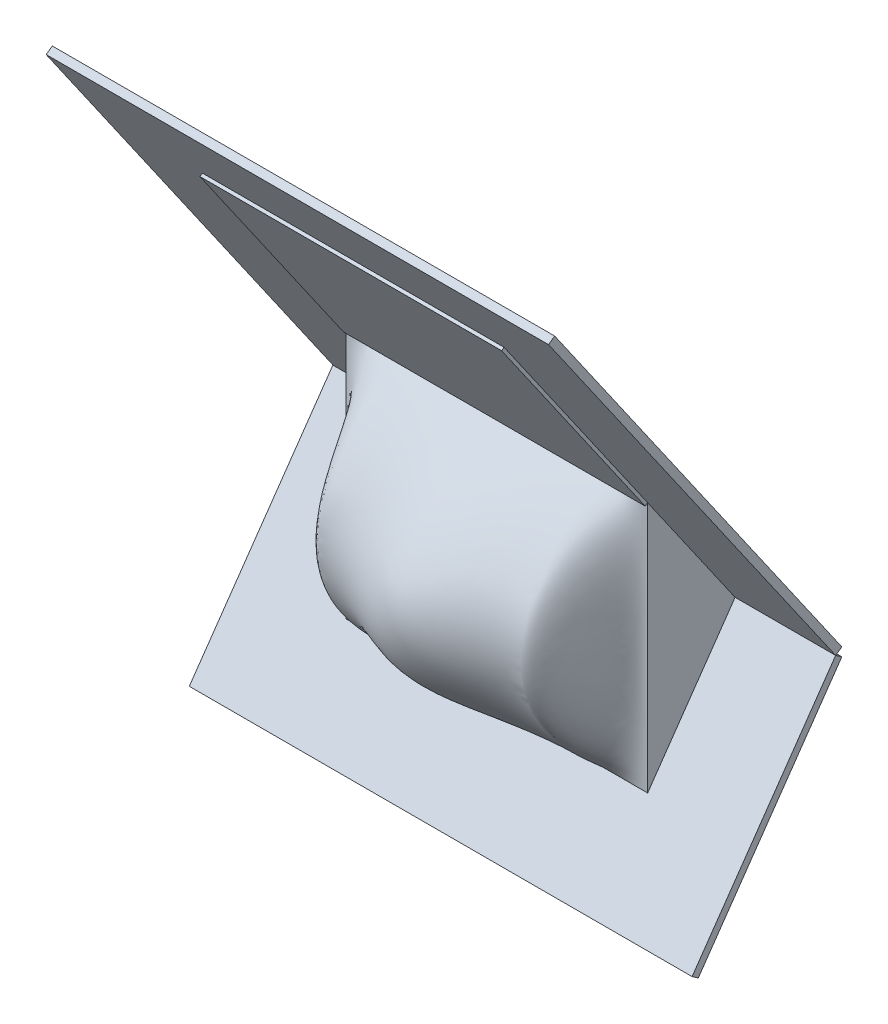
ISO-10303-21;
HEADER;
FILE_DESCRIPTION(('STEP AP214'),'2;1');
FILE_NAME('part.step','',(''),(''),'','','');
FILE_SCHEMA(('AUTOMOTIVE_DESIGN { 1 0 10303 214 1 1 1 1 }'));
ENDSEC;
DATA;
#1=APPLICATION_CONTEXT('core data for automotive mechanical design processes');
#2=APPLICATION_PROTOCOL_DEFINITION('international standard','automotive_design',2000,#1);
#3=PRODUCT_CONTEXT('',#1,'mechanical');
#4=PRODUCT('Part','Part','',(#3));
#5=PRODUCT_RELATED_PRODUCT_CATEGORY('part','',(#4));
#6=PRODUCT_DEFINITION_FORMATION('','',#4);
#7=PRODUCT_DEFINITION_CONTEXT('part definition',#1,'design');
#8=PRODUCT_DEFINITION('design','',#6,#7);
#9=PRODUCT_DEFINITION_SHAPE('','',#8);
#10=(LENGTH_UNIT() NAMED_UNIT(*) SI_UNIT(.MILLI.,.METRE.));
#11=(NAMED_UNIT(*) PLANE_ANGLE_UNIT() SI_UNIT($,.RADIAN.));
#12=(NAMED_UNIT(*) SI_UNIT($,.STERADIAN.) SOLID_ANGLE_UNIT());
#13=UNCERTAINTY_MEASURE_WITH_UNIT(LENGTH_MEASURE(1.E-05),#10,'distance_accuracy_value','');
#14=(GEOMETRIC_REPRESENTATION_CONTEXT(3) GLOBAL_UNCERTAINTY_ASSIGNED_CONTEXT((#13)) GLOBAL_UNIT_ASSIGNED_CONTEXT((#10,
#11,#12)) REPRESENTATION_CONTEXT('',''));
#15=CARTESIAN_POINT('',(0.,0.,0.));
#16=DIRECTION('',(0.,0.,1.));
#17=DIRECTION('',(1.,0.,0.));
#18=AXIS2_PLACEMENT_3D('',#15,#16,#17);
#19=CARTESIAN_POINT('',(0.,-0.140637872858713,0.202163097279363));
#20=DIRECTION('',(0.,-0.571071807278898,0.820900110202948));
#21=DIRECTION('',(0.,-0.820900110202948,-0.571071807278898));
#22=AXIS2_PLACEMENT_3D('',#19,#20,#21);
#23=PLANE('',#22);
#24=DIRECTION('',(0.,-0.820900110202948,-0.571071807278898));
#25=VECTOR('',#24,1.);
#26=CARTESIAN_POINT('',(10.,-5.,-3.17832702286831));
#27=LINE('',#26,#25);
#28=CARTESIAN_POINT('',(10.,11.418002204059,8.24310912270965));
#29=VERTEX_POINT('',#28);
#30=CARTESIAN_POINT('',(10.,-5.,-3.17832702286831));
#31=VERTEX_POINT('',#30);
#32=EDGE_CURVE('E256',#29,#31,#27,.T.);
#33=ORIENTED_EDGE('',*,*,#32,.F.);
#34=DIRECTION('',(1.,0.,0.));
#35=VECTOR('',#34,1.);
#36=CARTESIAN_POINT('',(10.,11.418002204059,8.24310912270965));
#37=LINE('',#36,#35);
#38=CARTESIAN_POINT('',(-9.98236155550138,11.418002204059,8.24310912270965));
#39=VERTEX_POINT('',#38);
#40=EDGE_CURVE('E261',#39,#29,#37,.T.);
#41=ORIENTED_EDGE('',*,*,#40,.F.);
#42=DIRECTION('',(0.,0.820900110202948,0.571071807278898));
#43=VECTOR('',#42,1.);
#44=CARTESIAN_POINT('',(-9.98236155550138,-5.,-3.17832702286831));
#45=LINE('',#44,#43);
#46=CARTESIAN_POINT('',(-9.98236155550138,-5.,-3.17832702286831));
#47=VERTEX_POINT('',#46);
#48=EDGE_CURVE('E272',#47,#39,#45,.T.);
#49=ORIENTED_EDGE('',*,*,#48,.F.);
#50=DIRECTION('',(-1.,0.,0.));
#51=VECTOR('',#50,1.);
#52=CARTESIAN_POINT('',(10.,-5.,-3.17832702286831));
#53=LINE('',#52,#51);
#54=EDGE_CURVE('E270',#31,#47,#53,.T.);
#55=ORIENTED_EDGE('',*,*,#54,.F.);
#56=EDGE_LOOP('',(#33,#41,#49,#55));
#57=FACE_BOUND('',#56,.T.);
#58=DIRECTION('',(1.,0.,0.));
#59=VECTOR('',#58,1.);
#60=CARTESIAN_POINT('',(-5.99999999999999,0.,0.299999999999999));
#61=LINE('',#60,#59);
#62=CARTESIAN_POINT('',(-5.99999999999999,0.,0.299999999999999));
#63=VERTEX_POINT('',#62);
#64=CARTESIAN_POINT('',(6.00000000000001,0.,0.299999999999999));
#65=VERTEX_POINT('',#64);
#66=EDGE_CURVE('E446',#63,#65,#61,.T.);
#67=ORIENTED_EDGE('',*,*,#66,.F.);
#68=DIRECTION('',(0.,-0.820900110202948,-0.571071807278898));
#69=VECTOR('',#68,1.);
#70=CARTESIAN_POINT('',(-5.99999999999999,0.,0.299999999999999));
#71=LINE('',#70,#69);
#72=CARTESIAN_POINT('',(-5.99999999999999,8.20900110202948,6.01071807278898));
#73=VERTEX_POINT('',#72);
#74=EDGE_CURVE('E220',#73,#63,#71,.T.);
#75=ORIENTED_EDGE('',*,*,#74,.F.);
#76=DIRECTION('',(-1.,0.,0.));
#77=VECTOR('',#76,1.);
#78=CARTESIAN_POINT('',(-5.99999999999999,8.20900110202948,6.01071807278898));
#79=LINE('',#78,#77);
#80=CARTESIAN_POINT('',(6.00000000000001,8.20900110202948,6.01071807278898));
#81=VERTEX_POINT('',#80);
#82=EDGE_CURVE('E216',#81,#73,#79,.T.);
#83=ORIENTED_EDGE('',*,*,#82,.F.);
#84=DIRECTION('',(0.,0.820900110202948,0.571071807278898));
#85=VECTOR('',#84,1.);
#86=CARTESIAN_POINT('',(6.00000000000001,0.,0.299999999999999));
#87=LINE('',#86,#85);
#88=EDGE_CURVE('E443',#65,#81,#87,.T.);
#89=ORIENTED_EDGE('',*,*,#88,.F.);
#90=EDGE_LOOP('',(#67,#75,#83,#89));
#91=FACE_BOUND('',#90,.T.);
#92=ADVANCED_FACE('F108',(#57,#91),#23,.T.);
#93=CARTESIAN_POINT('',(0.,0.0306836693249566,-0.0441069357815213));
#94=DIRECTION('',(0.,-0.571071807278898,0.820900110202948));
#95=DIRECTION('',(0.,-0.820900110202948,-0.571071807278898));
#96=AXIS2_PLACEMENT_3D('',#93,#94,#95);
#97=PLANE('',#96);
#98=DIRECTION('',(0.,-0.820900110202948,-0.571071807278898));
#99=VECTOR('',#98,1.);
#100=CARTESIAN_POINT('',(10.,-4.82867845781633,-3.4245970559292));
#101=LINE('',#100,#99);
#102=CARTESIAN_POINT('',(10.,11.5893237462426,7.99683908964877));
#103=VERTEX_POINT('',#102);
#104=CARTESIAN_POINT('',(10.,-4.82867845781633,-3.4245970559292));
#105=VERTEX_POINT('',#104);
#106=EDGE_CURVE('E257',#103,#105,#101,.T.);
#107=ORIENTED_EDGE('',*,*,#106,.T.);
#108=DIRECTION('',(-1.,0.,0.));
#109=VECTOR('',#108,1.);
#110=CARTESIAN_POINT('',(10.,-4.82867845781633,-3.4245970559292));
#111=LINE('',#110,#109);
#112=CARTESIAN_POINT('',(-9.98236155550138,-4.82867845781633,-3.4245970559292));
#113=VERTEX_POINT('',#112);
#114=EDGE_CURVE('E260',#105,#113,#111,.T.);
#115=ORIENTED_EDGE('',*,*,#114,.T.);
#116=DIRECTION('',(0.,0.820900110202948,0.571071807278898));
#117=VECTOR('',#116,1.);
#118=CARTESIAN_POINT('',(-9.98236155550138,-4.82867845781633,-3.4245970559292));
#119=LINE('',#118,#117);
#120=CARTESIAN_POINT('',(-9.98236155550138,11.5893237462426,7.99683908964877));
#121=VERTEX_POINT('',#120);
#122=EDGE_CURVE('E263',#113,#121,#119,.T.);
#123=ORIENTED_EDGE('',*,*,#122,.T.);
#124=DIRECTION('',(1.,0.,0.));
#125=VECTOR('',#124,1.);
#126=CARTESIAN_POINT('',(10.,11.5893237462426,7.99683908964877));
#127=LINE('',#126,#125);
#128=EDGE_CURVE('E265',#121,#103,#127,.T.);
#129=ORIENTED_EDGE('',*,*,#128,.T.);
#130=EDGE_LOOP('',(#107,#115,#123,#129));
#131=FACE_BOUND('',#130,.T.);
#132=DIRECTION('',(1.,0.,0.));
#133=VECTOR('',#132,1.);
#134=CARTESIAN_POINT('',(-5.99999999999999,8.38032264421315,5.7644480397281));
#135=LINE('',#134,#133);
#136=CARTESIAN_POINT('',(-5.99999999999999,8.38032264421315,5.7644480397281));
#137=VERTEX_POINT('',#136);
#138=CARTESIAN_POINT('',(6.00000000000001,8.38032264421315,5.7644480397281));
#139=VERTEX_POINT('',#138);
#140=EDGE_CURVE('E222',#137,#139,#135,.T.);
#141=ORIENTED_EDGE('',*,*,#140,.F.);
#142=DIRECTION('',(0.,0.820900110202948,0.571071807278898));
#143=VECTOR('',#142,1.);
#144=CARTESIAN_POINT('',(-5.99999999999999,0.17132154218367,0.0537299669391148));
#145=LINE('',#144,#143);
#146=CARTESIAN_POINT('',(-5.99999999999999,0.17132154218367,0.0537299669391148));
#147=VERTEX_POINT('',#146);
#148=EDGE_CURVE('E233',#147,#137,#145,.T.);
#149=ORIENTED_EDGE('',*,*,#148,.F.);
#150=DIRECTION('',(-1.,0.,0.));
#151=VECTOR('',#150,1.);
#152=CARTESIAN_POINT('',(6.00000000000001,0.17132154218367,0.0537299669391148));
#153=LINE('',#152,#151);
#154=CARTESIAN_POINT('',(6.00000000000001,0.17132154218367,0.0537299669391148));
#155=VERTEX_POINT('',#154);
#156=EDGE_CURVE('E241',#155,#147,#153,.T.);
#157=ORIENTED_EDGE('',*,*,#156,.F.);
#158=DIRECTION('',(0.,-0.820900110202948,-0.571071807278898));
#159=VECTOR('',#158,1.);
#160=CARTESIAN_POINT('',(6.00000000000001,8.38032264421315,5.7644480397281));
#161=LINE('',#160,#159);
#162=EDGE_CURVE('E131',#139,#155,#161,.T.);
#163=ORIENTED_EDGE('',*,*,#162,.F.);
#164=EDGE_LOOP('',(#141,#149,#157,#163));
#165=FACE_BOUND('',#164,.T.);
#166=ADVANCED_FACE('F299',(#131,#165),#97,.F.);
#167=CARTESIAN_POINT('',(10.,-4.82867845781633,-3.4245970559292));
#168=DIRECTION('',(-1.,0.,0.));
#169=DIRECTION('',(0.,0.,1.));
#170=AXIS2_PLACEMENT_3D('',#167,#168,#169);
#171=PLANE('',#170);
#172=ORIENTED_EDGE('',*,*,#32,.T.);
#173=DIRECTION('',(0.,-0.571071807278898,0.820900110202948));
#174=VECTOR('',#173,1.);
#175=CARTESIAN_POINT('',(10.,-4.82867845781633,-3.4245970559292));
#176=LINE('',#175,#174);
#177=EDGE_CURVE('E14',#105,#31,#176,.T.);
#178=ORIENTED_EDGE('',*,*,#177,.F.);
#179=ORIENTED_EDGE('',*,*,#106,.F.);
#180=DIRECTION('',(0.,-0.571071807278898,0.820900110202948));
#181=VECTOR('',#180,1.);
#182=CARTESIAN_POINT('',(10.,11.5893237462426,7.99683908964877));
#183=LINE('',#182,#181);
#184=EDGE_CURVE('E267',#103,#29,#183,.T.);
#185=ORIENTED_EDGE('',*,*,#184,.T.);
#186=EDGE_LOOP('',(#172,#178,#179,#185));
#187=FACE_BOUND('',#186,.T.);
#188=ADVANCED_FACE('F110',(#187),#171,.F.);
#189=CARTESIAN_POINT('',(10.,-4.82867845781633,-3.4245970559292));
#190=DIRECTION('',(0.,0.820900110202948,0.571071807278898));
#191=DIRECTION('',(0.,-0.571071807278898,0.820900110202949));
#192=AXIS2_PLACEMENT_3D('',#189,#190,#191);
#193=PLANE('',#192);
#194=ORIENTED_EDGE('',*,*,#54,.T.);
#195=DIRECTION('',(0.,-0.571071807278898,0.820900110202948));
#196=VECTOR('',#195,1.);
#197=CARTESIAN_POINT('',(-9.98236155550138,-4.82867845781633,-3.4245970559292));
#198=LINE('',#197,#196);
#199=EDGE_CURVE('E116',#113,#47,#198,.T.);
#200=ORIENTED_EDGE('',*,*,#199,.F.);
#201=ORIENTED_EDGE('',*,*,#114,.F.);
#202=ORIENTED_EDGE('',*,*,#177,.T.);
#203=EDGE_LOOP('',(#194,#200,#201,#202));
#204=FACE_BOUND('',#203,.T.);
#205=ADVANCED_FACE('F300',(#204),#193,.F.);
#206=CARTESIAN_POINT('',(-9.98236155550138,-4.82867845781633,-3.4245970559292));
#207=DIRECTION('',(1.,0.,0.));
#208=DIRECTION('',(0.,0.,-1.));
#209=AXIS2_PLACEMENT_3D('',#206,#207,#208);
#210=PLANE('',#209);
#211=ORIENTED_EDGE('',*,*,#48,.T.);
#212=DIRECTION('',(0.,-0.571071807278898,0.820900110202948));
#213=VECTOR('',#212,1.);
#214=CARTESIAN_POINT('',(-9.98236155550138,11.5893237462426,7.99683908964877));
#215=LINE('',#214,#213);
#216=EDGE_CURVE('E277',#121,#39,#215,.T.);
#217=ORIENTED_EDGE('',*,*,#216,.F.);
#218=ORIENTED_EDGE('',*,*,#122,.F.);
#219=ORIENTED_EDGE('',*,*,#199,.T.);
#220=EDGE_LOOP('',(#211,#217,#218,#219));
#221=FACE_BOUND('',#220,.T.);
#222=ADVANCED_FACE('F284',(#221),#210,.F.);
#223=CARTESIAN_POINT('',(10.,11.5893237462426,7.99683908964877));
#224=DIRECTION('',(0.,-0.820900110202948,-0.571071807278898));
#225=DIRECTION('',(0.,0.571071807278898,-0.820900110202949));
#226=AXIS2_PLACEMENT_3D('',#223,#224,#225);
#227=PLANE('',#226);
#228=ORIENTED_EDGE('',*,*,#40,.T.);
#229=ORIENTED_EDGE('',*,*,#184,.F.);
#230=ORIENTED_EDGE('',*,*,#128,.F.);
#231=ORIENTED_EDGE('',*,*,#216,.T.);
#232=EDGE_LOOP('',(#228,#229,#230,#231));
#233=FACE_BOUND('',#232,.T.);
#234=ADVANCED_FACE('F293',(#233),#227,.F.);
#235=CARTESIAN_POINT('',(-5.99999999999999,8.43742982494104,5.6823580287078));
#236=DIRECTION('',(0.,-0.820900110202949,-0.571071807278898));
#237=DIRECTION('',(0.,0.571071807278898,-0.820900110202949));
#238=AXIS2_PLACEMENT_3D('',#235,#236,#237);
#239=PLANE('',#238);
#240=ORIENTED_EDGE('',*,*,#140,.T.);
#241=DIRECTION('',(0.,-0.571071807278898,0.820900110202949));
#242=VECTOR('',#241,1.);
#243=CARTESIAN_POINT('',(6.00000000000001,8.43742982494104,5.6823580287078));
#244=LINE('',#243,#242);
#245=CARTESIAN_POINT('',(6.00000000000001,8.43742982494104,5.6823580287078));
#246=VERTEX_POINT('',#245);
#247=EDGE_CURVE('E254',#246,#139,#244,.T.);
#248=ORIENTED_EDGE('',*,*,#247,.F.);
#249=DIRECTION('',(1.,0.,0.));
#250=VECTOR('',#249,1.);
#251=CARTESIAN_POINT('',(-5.99999999999999,8.43742982494104,5.6823580287078));
#252=LINE('',#251,#250);
#253=CARTESIAN_POINT('',(-5.99999999999999,8.43742982494104,5.6823580287078));
#254=VERTEX_POINT('',#253);
#255=EDGE_CURVE('E229',#254,#246,#252,.T.);
#256=ORIENTED_EDGE('',*,*,#255,.F.);
#257=DIRECTION('',(0.,-0.571071807278898,0.820900110202949));
#258=VECTOR('',#257,1.);
#259=CARTESIAN_POINT('',(-5.99999999999999,8.43742982494104,5.6823580287078));
#260=LINE('',#259,#258);
#261=EDGE_CURVE('E238',#254,#137,#260,.T.);
#262=ORIENTED_EDGE('',*,*,#261,.T.);
#263=EDGE_LOOP('',(#240,#248,#256,#262));
#264=FACE_BOUND('',#263,.T.);
#265=ADVANCED_FACE('F316',(#264),#239,.F.);
#266=CARTESIAN_POINT('',(6.00000000000001,8.43742982494104,5.6823580287078));
#267=DIRECTION('',(-1.,0.,0.));
#268=DIRECTION('',(0.,0.,1.));
#269=AXIS2_PLACEMENT_3D('',#266,#267,#268);
#270=PLANE('',#269);
#271=ORIENTED_EDGE('',*,*,#162,.T.);
#272=DIRECTION('',(0.,-0.571071807278898,0.820900110202949));
#273=VECTOR('',#272,1.);
#274=CARTESIAN_POINT('',(6.00000000000001,0.22842872291156,-0.02836004408118));
#275=LINE('',#274,#273);
#276=CARTESIAN_POINT('',(6.00000000000001,0.22842872291156,-0.02836004408118));
#277=VERTEX_POINT('',#276);
#278=EDGE_CURVE('E251',#277,#155,#275,.T.);
#279=ORIENTED_EDGE('',*,*,#278,.F.);
#280=DIRECTION('',(0.,-0.820900110202948,-0.571071807278898));
#281=VECTOR('',#280,1.);
#282=CARTESIAN_POINT('',(6.00000000000001,8.43742982494104,5.6823580287078));
#283=LINE('',#282,#281);
#284=EDGE_CURVE('E232',#246,#277,#283,.T.);
#285=ORIENTED_EDGE('',*,*,#284,.F.);
#286=ORIENTED_EDGE('',*,*,#247,.T.);
#287=EDGE_LOOP('',(#271,#279,#285,#286));
#288=FACE_BOUND('',#287,.T.);
#289=ADVANCED_FACE('F320',(#288),#270,.F.);
#290=CARTESIAN_POINT('',(6.00000000000001,0.22842872291156,-0.02836004408118));
#291=DIRECTION('',(0.,0.820900110202949,0.571071807278898));
#292=DIRECTION('',(0.,-0.571071807278898,0.820900110202949));
#293=AXIS2_PLACEMENT_3D('',#290,#291,#292);
#294=PLANE('',#293);
#295=ORIENTED_EDGE('',*,*,#156,.T.);
#296=DIRECTION('',(0.,-0.571071807278898,0.820900110202949));
#297=VECTOR('',#296,1.);
#298=CARTESIAN_POINT('',(-5.99999999999999,0.22842872291156,-0.02836004408118));
#299=LINE('',#298,#297);
#300=CARTESIAN_POINT('',(-5.99999999999999,0.22842872291156,-0.02836004408118));
#301=VERTEX_POINT('',#300);
#302=EDGE_CURVE('E248',#301,#147,#299,.T.);
#303=ORIENTED_EDGE('',*,*,#302,.F.);
#304=DIRECTION('',(-1.,0.,0.));
#305=VECTOR('',#304,1.);
#306=CARTESIAN_POINT('',(6.00000000000001,0.22842872291156,-0.02836004408118));
#307=LINE('',#306,#305);
#308=EDGE_CURVE('E235',#277,#301,#307,.T.);
#309=ORIENTED_EDGE('',*,*,#308,.F.);
#310=ORIENTED_EDGE('',*,*,#278,.T.);
#311=EDGE_LOOP('',(#295,#303,#309,#310));
#312=FACE_BOUND('',#311,.T.);
#313=ADVANCED_FACE('F325',(#312),#294,.F.);
#314=CARTESIAN_POINT('',(-5.99999999999999,0.22842872291156,-0.02836004408118));
#315=DIRECTION('',(1.,0.,0.));
#316=DIRECTION('',(0.,0.,-1.));
#317=AXIS2_PLACEMENT_3D('',#314,#315,#316);
#318=PLANE('',#317);
#319=ORIENTED_EDGE('',*,*,#148,.T.);
#320=ORIENTED_EDGE('',*,*,#261,.F.);
#321=DIRECTION('',(0.,0.820900110202948,0.571071807278898));
#322=VECTOR('',#321,1.);
#323=CARTESIAN_POINT('',(-5.99999999999999,0.22842872291156,-0.02836004408118));
#324=LINE('',#323,#322);
#325=EDGE_CURVE('E237',#301,#254,#324,.T.);
#326=ORIENTED_EDGE('',*,*,#325,.F.);
#327=ORIENTED_EDGE('',*,*,#302,.T.);
#328=EDGE_LOOP('',(#319,#320,#326,#327));
#329=FACE_BOUND('',#328,.T.);
#330=ADVANCED_FACE('F331',(#329),#318,.F.);
#331=CARTESIAN_POINT('',(0.,0.0877908500528464,-0.126196946801816));
#332=DIRECTION('',(0.,0.571071807278898,-0.820900110202948));
#333=DIRECTION('',(0.,0.820900110202948,0.571071807278898));
#334=AXIS2_PLACEMENT_3D('',#331,#332,#333);
#335=PLANE('',#334);
#336=ORIENTED_EDGE('',*,*,#255,.T.);
#337=ORIENTED_EDGE('',*,*,#284,.T.);
#338=ORIENTED_EDGE('',*,*,#308,.T.);
#339=ORIENTED_EDGE('',*,*,#325,.T.);
#340=EDGE_LOOP('',(#336,#337,#338,#339));
#341=FACE_BOUND('',#340,.T.);
#342=ADVANCED_FACE('F335',(#341),#335,.T.);
#343=CARTESIAN_POINT('',(-5.99999999999999,-0.0685286168734674,0.398508013224353));
#344=DIRECTION('',(1.,0.,0.));
#345=DIRECTION('',(0.,0.,-1.));
#346=AXIS2_PLACEMENT_3D('',#343,#344,#345);
#347=PLANE('',#346);
#348=ORIENTED_EDGE('',*,*,#74,.T.);
#349=DIRECTION('',(0.,0.571071807278898,-0.820900110202948));
#350=VECTOR('',#349,1.);
#351=CARTESIAN_POINT('',(-5.99999999999999,-0.0685286168734674,0.398508013224353));
#352=LINE('',#351,#350);
#353=CARTESIAN_POINT('',(-5.99999999999999,-0.0685286168734674,0.398508013224353));
#354=VERTEX_POINT('',#353);
#355=EDGE_CURVE('E201',#354,#63,#352,.T.);
#356=ORIENTED_EDGE('',*,*,#355,.F.);
#357=DIRECTION('',(0.,-0.820900110202948,-0.571071807278898));
#358=VECTOR('',#357,1.);
#359=CARTESIAN_POINT('',(-5.99999999999999,-0.0685286168734674,0.398508013224353));
#360=LINE('',#359,#358);
#361=CARTESIAN_POINT('',(-5.99999999999999,8.14047248515602,6.10922608601334));
#362=VERTEX_POINT('',#361);
#363=EDGE_CURVE('E208',#362,#354,#360,.T.);
#364=ORIENTED_EDGE('',*,*,#363,.F.);
#365=DIRECTION('',(0.,0.571071807278898,-0.820900110202948));
#366=VECTOR('',#365,1.);
#367=CARTESIAN_POINT('',(-5.99999999999999,8.14047248515602,6.10922608601334));
#368=LINE('',#367,#366);
#369=EDGE_CURVE('E441',#362,#73,#368,.T.);
#370=ORIENTED_EDGE('',*,*,#369,.T.);
#371=EDGE_LOOP('',(#348,#356,#364,#370));
#372=FACE_BOUND('',#371,.T.);
#373=ADVANCED_FACE('F218',(#372),#347,.F.);
#374=CARTESIAN_POINT('',(-5.99999999999999,-0.0685286168734674,0.398508013224353));
#375=DIRECTION('',(0.,0.820900110202948,0.571071807278898));
#376=DIRECTION('',(0.,-0.571071807278898,0.820900110202948));
#377=AXIS2_PLACEMENT_3D('',#374,#375,#376);
#378=PLANE('',#377);
#379=ORIENTED_EDGE('',*,*,#66,.T.);
#380=DIRECTION('',(0.,0.571071807278898,-0.820900110202948));
#381=VECTOR('',#380,1.);
#382=CARTESIAN_POINT('',(6.00000000000001,-0.0685286168734674,0.398508013224353));
#383=LINE('',#382,#381);
#384=CARTESIAN_POINT('',(6.00000000000001,-0.0685286168734674,0.398508013224353));
#385=VERTEX_POINT('',#384);
#386=EDGE_CURVE('E204',#385,#65,#383,.T.);
#387=ORIENTED_EDGE('',*,*,#386,.F.);
#388=DIRECTION('',(1.,0.,0.));
#389=VECTOR('',#388,1.);
#390=CARTESIAN_POINT('',(-5.99999999999999,-0.0685286168734674,0.398508013224353));
#391=LINE('',#390,#389);
#392=EDGE_CURVE('E197',#354,#385,#391,.T.);
#393=ORIENTED_EDGE('',*,*,#392,.F.);
#394=ORIENTED_EDGE('',*,*,#355,.T.);
#395=EDGE_LOOP('',(#379,#387,#393,#394));
#396=FACE_BOUND('',#395,.T.);
#397=ADVANCED_FACE('F199',(#396),#378,.F.);
#398=CARTESIAN_POINT('',(6.00000000000001,-0.0685286168734674,0.398508013224353));
#399=DIRECTION('',(-1.,0.,0.));
#400=DIRECTION('',(0.,0.,1.));
#401=AXIS2_PLACEMENT_3D('',#398,#399,#400);
#402=PLANE('',#401);
#403=ORIENTED_EDGE('',*,*,#88,.T.);
#404=DIRECTION('',(0.,0.571071807278898,-0.820900110202948));
#405=VECTOR('',#404,1.);
#406=CARTESIAN_POINT('',(6.00000000000001,8.14047248515602,6.10922608601334));
#407=LINE('',#406,#405);
#408=CARTESIAN_POINT('',(6.00000000000001,8.14047248515602,6.10922608601334));
#409=VERTEX_POINT('',#408);
#410=EDGE_CURVE('E123',#409,#81,#407,.T.);
#411=ORIENTED_EDGE('',*,*,#410,.F.);
#412=DIRECTION('',(0.,0.820900110202948,0.571071807278898));
#413=VECTOR('',#412,1.);
#414=CARTESIAN_POINT('',(6.00000000000001,-0.0685286168734674,0.398508013224353));
#415=LINE('',#414,#413);
#416=EDGE_CURVE('E207',#385,#409,#415,.T.);
#417=ORIENTED_EDGE('',*,*,#416,.F.);
#418=ORIENTED_EDGE('',*,*,#386,.T.);
#419=EDGE_LOOP('',(#403,#411,#417,#418));
#420=FACE_BOUND('',#419,.T.);
#421=ADVANCED_FACE('F344',(#420),#402,.F.);
#422=CARTESIAN_POINT('',(-5.99999999999999,8.14047248515602,6.10922608601334));
#423=DIRECTION('',(0.,-0.820900110202948,-0.571071807278898));
#424=DIRECTION('',(0.,0.571071807278898,-0.820900110202948));
#425=AXIS2_PLACEMENT_3D('',#422,#423,#424);
#426=PLANE('',#425);
#427=ORIENTED_EDGE('',*,*,#82,.T.);
#428=ORIENTED_EDGE('',*,*,#369,.F.);
#429=DIRECTION('',(-1.,0.,0.));
#430=VECTOR('',#429,1.);
#431=CARTESIAN_POINT('',(-5.99999999999999,8.14047248515602,6.10922608601334));
#432=LINE('',#431,#430);
#433=EDGE_CURVE('E212',#409,#362,#432,.T.);
#434=ORIENTED_EDGE('',*,*,#433,.F.);
#435=ORIENTED_EDGE('',*,*,#410,.T.);
#436=EDGE_LOOP('',(#427,#428,#434,#435));
#437=FACE_BOUND('',#436,.T.);
#438=ADVANCED_FACE('F347',(#437),#426,.F.);
#439=CARTESIAN_POINT('',(0.,-0.209166489732181,0.300671110503717));
#440=DIRECTION('',(0.,0.571071807278898,-0.820900110202948));
#441=DIRECTION('',(0.,0.820900110202948,0.571071807278898));
#442=AXIS2_PLACEMENT_3D('',#439,#440,#441);
#443=PLANE('',#442);
#444=ORIENTED_EDGE('',*,*,#363,.T.);
#445=ORIENTED_EDGE('',*,*,#392,.T.);
#446=ORIENTED_EDGE('',*,*,#416,.T.);
#447=ORIENTED_EDGE('',*,*,#433,.T.);
#448=EDGE_LOOP('',(#444,#445,#446,#447));
#449=FACE_BOUND('',#448,.T.);
#450=ADVANCED_FACE('F211',(#449),#443,.F.);
#451=CLOSED_SHELL('',(#92,#166,#188,#205,#222,#234,#265,#289,#313,#330,#342,#373,#397,#421,#438,#450));
#452=MANIFOLD_SOLID_BREP('B2',#451);
#453=CARTESIAN_POINT('',(5.99999999999999,0.,0.3));
#454=DIRECTION('',(0.,0.571071807278898,-0.820900110202948));
#455=DIRECTION('',(0.,0.820900110202948,0.571071807278898));
#456=AXIS2_PLACEMENT_3D('',#453,#454,#455);
#457=PLANE('',#456);
#458=DIRECTION('',(-1.,0.,0.));
#459=VECTOR('',#458,1.);
#460=CARTESIAN_POINT('',(5.99999999999999,-5.,-3.17832702286831));
#461=LINE('',#460,#459);
#462=CARTESIAN_POINT('',(5.99999999999999,-5.,-3.17832702286831));
#463=VERTEX_POINT('',#462);
#464=CARTESIAN_POINT('',(-5.99999999999999,-5.,-3.17832702286831));
#465=VERTEX_POINT('',#464);
#466=EDGE_CURVE('E568',#463,#465,#461,.T.);
#467=ORIENTED_EDGE('',*,*,#466,.T.);
#468=DIRECTION('',(0.,-0.820900110202948,-0.571071807278899));
#469=VECTOR('',#468,1.);
#470=CARTESIAN_POINT('',(-5.99999999999999,0.,0.3));
#471=LINE('',#470,#469);
#472=CARTESIAN_POINT('',(-5.99999999999999,0.,0.3));
#473=VERTEX_POINT('',#472);
#474=EDGE_CURVE('E554',#473,#465,#471,.T.);
#475=ORIENTED_EDGE('',*,*,#474,.F.);
#476=DIRECTION('',(1.,0.,0.));
#477=VECTOR('',#476,1.);
#478=CARTESIAN_POINT('',(-5.99999999999999,0.,0.3));
#479=LINE('',#478,#477);
#480=CARTESIAN_POINT('',(5.99999999999999,0.,0.3));
#481=VERTEX_POINT('',#480);
#482=EDGE_CURVE('E480',#473,#481,#479,.T.);
#483=ORIENTED_EDGE('',*,*,#482,.T.);
#484=DIRECTION('',(0.,-0.820900110202948,-0.571071807278899));
#485=VECTOR('',#484,1.);
#486=CARTESIAN_POINT('',(5.99999999999999,0.,0.3));
#487=LINE('',#486,#485);
#488=EDGE_CURVE('E605',#481,#463,#487,.T.);
#489=ORIENTED_EDGE('',*,*,#488,.T.);
#490=EDGE_LOOP('',(#467,#475,#483,#489));
#491=FACE_BOUND('',#490,.T.);
#492=ADVANCED_FACE('F461',(#491),#457,.T.);
#493=CARTESIAN_POINT('',(5.99999999999999,0.,0.));
#494=DIRECTION('',(-1.,0.,0.));
#495=DIRECTION('',(0.,0.,1.));
#496=AXIS2_PLACEMENT_3D('',#493,#494,#495);
#497=PLANE('',#496);
#498=DIRECTION('',(0.,1.,0.));
#499=VECTOR('',#498,1.);
#500=CARTESIAN_POINT('',(5.99999999999999,-5.,0.3));
#501=LINE('',#500,#499);
#502=CARTESIAN_POINT('',(5.99999999999999,-9.99999999999999,0.3));
#503=VERTEX_POINT('',#502);
#504=EDGE_CURVE('E616',#503,#481,#501,.T.);
#505=ORIENTED_EDGE('',*,*,#504,.F.);
#506=DIRECTION('',(0.,-0.820900110202948,0.571071807278899));
#507=VECTOR('',#506,1.);
#508=CARTESIAN_POINT('',(5.99999999999999,-5.,-3.17832702286831));
#509=LINE('',#508,#507);
#510=EDGE_CURVE('E488',#463,#503,#509,.T.);
#511=ORIENTED_EDGE('',*,*,#510,.F.);
#512=ORIENTED_EDGE('',*,*,#488,.F.);
#513=EDGE_LOOP('',(#505,#511,#512));
#514=FACE_BOUND('',#513,.T.);
#515=ADVANCED_FACE('F595',(#514),#497,.F.);
#516=CARTESIAN_POINT('',(-5.99999999999999,0.,0.));
#517=DIRECTION('',(-1.,0.,0.));
#518=DIRECTION('',(0.,0.,1.));
#519=AXIS2_PLACEMENT_3D('',#516,#517,#518);
#520=PLANE('',#519);
#521=DIRECTION('',(0.,-1.,0.));
#522=VECTOR('',#521,1.);
#523=CARTESIAN_POINT('',(-5.99999999999999,-5.,0.3));
#524=LINE('',#523,#522);
#525=CARTESIAN_POINT('',(-6.,-9.99999999999999,0.3));
#526=VERTEX_POINT('',#525);
#527=EDGE_CURVE('E473',#473,#526,#524,.T.);
#528=ORIENTED_EDGE('',*,*,#527,.F.);
#529=ORIENTED_EDGE('',*,*,#474,.T.);
#530=DIRECTION('',(0.,-0.820900110202948,0.571071807278899));
#531=VECTOR('',#530,1.);
#532=CARTESIAN_POINT('',(-5.99999999999999,-5.,-3.17832702286831));
#533=LINE('',#532,#531);
#534=EDGE_CURVE('E551',#465,#526,#533,.T.);
#535=ORIENTED_EDGE('',*,*,#534,.T.);
#536=EDGE_LOOP('',(#528,#529,#535));
#537=FACE_BOUND('',#536,.T.);
#538=ADVANCED_FACE('F592',(#537),#520,.T.);
#539=CARTESIAN_POINT('',(6.,0.,0.3));
#540=CARTESIAN_POINT('',(6.,-3.33333333333333,0.3));
#541=CARTESIAN_POINT('',(5.99999999999999,-6.66666666666666,0.3));
#542=CARTESIAN_POINT('',(6.,-9.99999999999999,0.3));
#543=CARTESIAN_POINT('',(5.83333333333333,0.,0.3));
#544=CARTESIAN_POINT('',(5.83333333333333,-3.33333333333333,0.3));
#545=CARTESIAN_POINT('',(5.83333333333333,-6.66666666666666,0.3));
#546=CARTESIAN_POINT('',(5.83333333333333,-9.99999999999999,0.3));
#547=CARTESIAN_POINT('',(5.5,0.,0.300000000000001));
#548=CARTESIAN_POINT('',(5.5,-3.32922646658149,0.812167356463365));
#549=CARTESIAN_POINT('',(5.5,-6.66255979991483,0.812167356463365));
#550=CARTESIAN_POINT('',(5.5,-10.,0.300000000000001));
#551=CARTESIAN_POINT('',(4.99999999999999,0.,0.299999999999999));
#552=CARTESIAN_POINT('',(4.99999999999999,-3.31690586632595,2.34866942585346));
#553=CARTESIAN_POINT('',(4.99999999999999,-6.65023919965928,2.34866942585346));
#554=CARTESIAN_POINT('',(4.99999999999999,-9.99999999999999,0.299999999999999));
#555=CARTESIAN_POINT('',(4.5,0.,0.3));
#556=CARTESIAN_POINT('',(4.5,-3.30458526607041,3.88517149524355));
#557=CARTESIAN_POINT('',(4.5,-6.63791859940375,3.88517149524355));
#558=CARTESIAN_POINT('',(4.5,-10.,0.3));
#559=CARTESIAN_POINT('',(4.16666666666667,0.,0.3));
#560=CARTESIAN_POINT('',(4.16666666666667,-3.30047839931857,4.39733885170691));
#561=CARTESIAN_POINT('',(4.16666666666667,-6.6338117326519,4.39733885170691));
#562=CARTESIAN_POINT('',(4.16666666666667,-9.99999999999999,0.3));
#563=CARTESIAN_POINT('',(3.66666666666667,0.,0.3));
#564=CARTESIAN_POINT('',(3.66666666666667,-3.30047839931857,4.39733885170691));
#565=CARTESIAN_POINT('',(3.66666666666667,-6.6338117326519,4.39733885170691));
#566=CARTESIAN_POINT('',(3.66666666666667,-9.99999999999999,0.3));
#567=CARTESIAN_POINT('',(3.00000000000001,0.,0.3));
#568=CARTESIAN_POINT('',(3.00000000000001,-3.30544589303699,4.61011841536773));
#569=CARTESIAN_POINT('',(3.00000000000001,-6.63877922637032,4.61011841536773));
#570=CARTESIAN_POINT('',(3.00000000000001,-9.99999999999999,0.3));
#571=CARTESIAN_POINT('',(1.99999999999999,0.,0.299999999999999));
#572=CARTESIAN_POINT('',(1.99999999999999,-3.32034837419228,5.24845710635019));
#573=CARTESIAN_POINT('',(1.99999999999999,-6.65368170752561,5.24845710635019));
#574=CARTESIAN_POINT('',(1.99999999999999,-10.,0.299999999999999));
#575=CARTESIAN_POINT('',(1.,0.,0.3));
#576=CARTESIAN_POINT('',(1.,-3.33525085534755,5.88679579733265));
#577=CARTESIAN_POINT('',(1.,-6.66858418868089,5.88679579733265));
#578=CARTESIAN_POINT('',(1.,-9.99999999999999,0.3));
#579=CARTESIAN_POINT('',(0.333333333333333,0.,0.3));
#580=CARTESIAN_POINT('',(0.333333333333333,-3.34021834906598,6.09957536099347));
#581=CARTESIAN_POINT('',(0.333333333333333,-6.67355168239931,6.09957536099347));
#582=CARTESIAN_POINT('',(0.333333333333333,-9.99999999999999,0.3));
#583=CARTESIAN_POINT('',(-0.333333333333333,0.,0.3));
#584=CARTESIAN_POINT('',(-0.333333333333334,-3.34021834906598,6.09957536099347));
#585=CARTESIAN_POINT('',(-0.333333333333334,-6.67355168239931,6.09957536099347));
#586=CARTESIAN_POINT('',(-0.333333333333333,-9.99999999999999,0.3));
#587=CARTESIAN_POINT('',(-1.,0.,0.3));
#588=CARTESIAN_POINT('',(-1.,-3.33525085534755,5.88679579733265));
#589=CARTESIAN_POINT('',(-1.,-6.66858418868088,5.88679579733265));
#590=CARTESIAN_POINT('',(-1.,-9.99999999999999,0.3));
#591=CARTESIAN_POINT('',(-2.,0.,0.3));
#592=CARTESIAN_POINT('',(-2.,-3.32034837419228,5.24845710635019));
#593=CARTESIAN_POINT('',(-2.,-6.65368170752562,5.24845710635019));
#594=CARTESIAN_POINT('',(-2.,-10.,0.3));
#595=CARTESIAN_POINT('',(-3.,0.,0.3));
#596=CARTESIAN_POINT('',(-3.,-3.30544589303699,4.61011841536773));
#597=CARTESIAN_POINT('',(-3.,-6.63877922637032,4.61011841536773));
#598=CARTESIAN_POINT('',(-3.,-9.99999999999999,0.3));
#599=CARTESIAN_POINT('',(-3.66666666666667,0.,0.3));
#600=CARTESIAN_POINT('',(-3.66666666666667,-3.30047839931857,4.39733885170691));
#601=CARTESIAN_POINT('',(-3.66666666666667,-6.6338117326519,4.39733885170691));
#602=CARTESIAN_POINT('',(-3.66666666666667,-9.99999999999999,0.3));
#603=CARTESIAN_POINT('',(-4.16666666666667,0.,0.3));
#604=CARTESIAN_POINT('',(-4.16666666666667,-3.30047839931857,4.39733885170691));
#605=CARTESIAN_POINT('',(-4.16666666666667,-6.6338117326519,4.39733885170691));
#606=CARTESIAN_POINT('',(-4.16666666666667,-9.99999999999999,0.3));
#607=CARTESIAN_POINT('',(-4.5,0.,0.3));
#608=CARTESIAN_POINT('',(-4.5,-3.30458526607041,3.88517149524355));
#609=CARTESIAN_POINT('',(-4.5,-6.63791859940374,3.88517149524355));
#610=CARTESIAN_POINT('',(-4.5,-9.99999999999999,0.3));
#611=CARTESIAN_POINT('',(-5.,0.,0.3));
#612=CARTESIAN_POINT('',(-5.,-3.31690586632595,2.34866942585345));
#613=CARTESIAN_POINT('',(-4.99999999999999,-6.65023919965928,2.34866942585345));
#614=CARTESIAN_POINT('',(-5.,-10.,0.3));
#615=CARTESIAN_POINT('',(-5.5,0.,0.3));
#616=CARTESIAN_POINT('',(-5.5,-3.32922646658149,0.812167356463362));
#617=CARTESIAN_POINT('',(-5.49999999999999,-6.66255979991482,0.812167356463362));
#618=CARTESIAN_POINT('',(-5.5,-9.99999999999999,0.3));
#619=CARTESIAN_POINT('',(-5.83333333333333,0.,0.3));
#620=CARTESIAN_POINT('',(-5.83333333333333,-3.33333333333333,0.3));
#621=CARTESIAN_POINT('',(-5.83333333333333,-6.66666666666666,0.3));
#622=CARTESIAN_POINT('',(-5.83333333333333,-9.99999999999999,0.3));
#623=CARTESIAN_POINT('',(-5.99999999999999,0.,0.3));
#624=CARTESIAN_POINT('',(-6.,-3.33333333333333,0.3));
#625=CARTESIAN_POINT('',(-5.99999999999999,-6.66666666666666,0.3));
#626=CARTESIAN_POINT('',(-5.99999999999999,-9.99999999999999,0.3));
#627=B_SPLINE_SURFACE_WITH_KNOTS('',3,3,((#539,#540,#541,#542),(#543,#544,#545,#546),(#547,#548,
#549,#550),(#551,#552,#553,#554),(#555,#556,#557,#558),(#559,#560,#561,#562),(#563,#564,#565,
#566),(#567,#568,#569,#570),(#571,#572,#573,#574),(#575,#576,#577,#578),(#579,#580,#581,#582),
(#583,#584,#585,#586),(#587,#588,#589,#590),(#591,#592,#593,#594),(#595,#596,#597,#598),(#599,
#600,#601,#602),(#603,#604,#605,#606),(#607,#608,#609,#610),(#611,#612,#613,#614),(#615,#616,
#617,#618),(#619,#620,#621,#622),(#623,#624,#625,#626)),.UNSPECIFIED.,.F.,.F.,.F.,(4,1,1,1,2,1,
1,1,2,1,1,1,2,1,1,1,4),(4,4),(0.,0.0416666666666667,0.0833333333333333,0.125,0.166666666666667,
0.25,0.333333333333333,0.416666666666667,0.5,0.583333333333333,0.666666666666667,0.75,
0.833333333333334,0.875,0.916666666666667,0.958333333333334,1.),(0.,1.),.UNSPECIFIED.);
#628=DIRECTION('',(-1.,0.,0.));
#629=VECTOR('',#628,1.);
#630=CARTESIAN_POINT('',(6.,-9.99999999999999,0.3));
#631=LINE('',#630,#629);
#632=EDGE_CURVE('E106',#503,#526,#631,.T.);
#633=ORIENTED_EDGE('',*,*,#482,.F.);
#634=ORIENTED_EDGE('',*,*,#527,.T.);
#635=ORIENTED_EDGE('',*,*,#632,.F.);
#636=ORIENTED_EDGE('',*,*,#504,.T.);
#637=EDGE_LOOP('',(#633,#634,#635,#636));
#638=FACE_BOUND('',#637,.T.);
#639=ADVANCED_FACE('F463',(#638),#627,.T.);
#640=CARTESIAN_POINT('',(0.,-3.12059221782916,-4.48576599801108));
#641=DIRECTION('',(0.,-0.571071807278899,-0.820900110202948));
#642=DIRECTION('',(0.,0.820900110202948,-0.571071807278899));
#643=AXIS2_PLACEMENT_3D('',#640,#641,#642);
#644=PLANE('',#643);
#645=DIRECTION('',(1.,0.,0.));
#646=VECTOR('',#645,1.);
#647=CARTESIAN_POINT('',(-10.,-4.99999999999999,-3.17832702286832));
#648=LINE('',#647,#646);
#649=CARTESIAN_POINT('',(10.,-5.,-3.17832702286831));
#650=VERTEX_POINT('',#649);
#651=EDGE_CURVE('E631',#463,#650,#648,.T.);
#652=ORIENTED_EDGE('',*,*,#651,.F.);
#653=ORIENTED_EDGE('',*,*,#510,.T.);
#654=ORIENTED_EDGE('',*,*,#632,.T.);
#655=ORIENTED_EDGE('',*,*,#534,.F.);
#656=CARTESIAN_POINT('',(-10.,-4.99999999999999,-3.17832702286832));
#657=VERTEX_POINT('',#656);
#658=EDGE_CURVE('E635',#657,#465,#648,.T.);
#659=ORIENTED_EDGE('',*,*,#658,.F.);
#660=DIRECTION('',(0.,0.820900110202948,-0.571071807278899));
#661=VECTOR('',#660,1.);
#662=CARTESIAN_POINT('',(-10.,-4.99999999999999,-3.17832702286832));
#663=LINE('',#662,#661);
#664=CARTESIAN_POINT('',(-10.,-13.2090011020295,2.53239104992067));
#665=VERTEX_POINT('',#664);
#666=EDGE_CURVE('E550',#665,#657,#663,.T.);
#667=ORIENTED_EDGE('',*,*,#666,.F.);
#668=DIRECTION('',(-1.,0.,0.));
#669=VECTOR('',#668,1.);
#670=CARTESIAN_POINT('',(10.,-13.2090011020295,2.53239104992067));
#671=LINE('',#670,#669);
#672=CARTESIAN_POINT('',(10.,-13.2090011020295,2.53239104992067));
#673=VERTEX_POINT('',#672);
#674=EDGE_CURVE('E546',#673,#665,#671,.T.);
#675=ORIENTED_EDGE('',*,*,#674,.F.);
#676=DIRECTION('',(0.,-0.820900110202948,0.571071807278899));
#677=VECTOR('',#676,1.);
#678=CARTESIAN_POINT('',(10.,-5.,-3.17832702286831));
#679=LINE('',#678,#677);
#680=EDGE_CURVE('E634',#650,#673,#679,.T.);
#681=ORIENTED_EDGE('',*,*,#680,.F.);
#682=EDGE_LOOP('',(#652,#653,#654,#655,#659,#667,#675,#681));
#683=FACE_BOUND('',#682,.T.);
#684=ADVANCED_FACE('F570',(#683),#644,.F.);
#685=CARTESIAN_POINT('',(-10.,-5.17132154218366,-3.4245970559292));
#686=DIRECTION('',(1.,0.,0.));
#687=DIRECTION('',(0.,1.,0.));
#688=AXIS2_PLACEMENT_3D('',#685,#686,#687);
#689=PLANE('',#688);
#690=ORIENTED_EDGE('',*,*,#666,.T.);
#691=DIRECTION('',(0.,0.571071807278899,0.820900110202948));
#692=VECTOR('',#691,1.);
#693=CARTESIAN_POINT('',(-10.,-5.17132154218366,-3.4245970559292));
#694=LINE('',#693,#692);
#695=CARTESIAN_POINT('',(-10.,-5.17132154218366,-3.4245970559292));
#696=VERTEX_POINT('',#695);
#697=EDGE_CURVE('E530',#696,#657,#694,.T.);
#698=ORIENTED_EDGE('',*,*,#697,.F.);
#699=DIRECTION('',(0.,0.820900110202948,-0.571071807278899));
#700=VECTOR('',#699,1.);
#701=CARTESIAN_POINT('',(-10.,-5.17132154218366,-3.4245970559292));
#702=LINE('',#701,#700);
#703=CARTESIAN_POINT('',(-10.,-13.3803226442131,2.28612101685979));
#704=VERTEX_POINT('',#703);
#705=EDGE_CURVE('E537',#704,#696,#702,.T.);
#706=ORIENTED_EDGE('',*,*,#705,.F.);
#707=DIRECTION('',(0.,0.571071807278899,0.820900110202948));
#708=VECTOR('',#707,1.);
#709=CARTESIAN_POINT('',(-10.,-13.3803226442131,2.28612101685979));
#710=LINE('',#709,#708);
#711=EDGE_CURVE('E658',#704,#665,#710,.T.);
#712=ORIENTED_EDGE('',*,*,#711,.T.);
#713=EDGE_LOOP('',(#690,#698,#706,#712));
#714=FACE_BOUND('',#713,.T.);
#715=ADVANCED_FACE('F548',(#714),#689,.F.);
#716=CARTESIAN_POINT('',(-10.,-5.17132154218366,-3.4245970559292));
#717=DIRECTION('',(0.,-0.820900110202948,0.571071807278899));
#718=DIRECTION('',(0.,-0.571071807278899,-0.820900110202948));
#719=AXIS2_PLACEMENT_3D('',#716,#717,#718);
#720=PLANE('',#719);
#721=ORIENTED_EDGE('',*,*,#658,.T.);
#722=ORIENTED_EDGE('',*,*,#466,.F.);
#723=ORIENTED_EDGE('',*,*,#651,.T.);
#724=DIRECTION('',(0.,0.571071807278899,0.820900110202948));
#725=VECTOR('',#724,1.);
#726=CARTESIAN_POINT('',(10.,-5.17132154218367,-3.4245970559292));
#727=LINE('',#726,#725);
#728=CARTESIAN_POINT('',(10.,-5.17132154218367,-3.4245970559292));
#729=VERTEX_POINT('',#728);
#730=EDGE_CURVE('E533',#729,#650,#727,.T.);
#731=ORIENTED_EDGE('',*,*,#730,.F.);
#732=DIRECTION('',(1.,0.,0.));
#733=VECTOR('',#732,1.);
#734=CARTESIAN_POINT('',(-10.,-5.17132154218366,-3.4245970559292));
#735=LINE('',#734,#733);
#736=EDGE_CURVE('E525',#696,#729,#735,.T.);
#737=ORIENTED_EDGE('',*,*,#736,.F.);
#738=ORIENTED_EDGE('',*,*,#697,.T.);
#739=EDGE_LOOP('',(#721,#722,#723,#731,#737,#738));
#740=FACE_BOUND('',#739,.T.);
#741=ADVANCED_FACE('F528',(#740),#720,.F.);
#742=CARTESIAN_POINT('',(10.,-5.17132154218367,-3.4245970559292));
#743=DIRECTION('',(-1.,0.,0.));
#744=DIRECTION('',(0.,0.,1.));
#745=AXIS2_PLACEMENT_3D('',#742,#743,#744);
#746=PLANE('',#745);
#747=ORIENTED_EDGE('',*,*,#680,.T.);
#748=DIRECTION('',(0.,0.571071807278899,0.820900110202948));
#749=VECTOR('',#748,1.);
#750=CARTESIAN_POINT('',(10.,-13.3803226442131,2.28612101685979));
#751=LINE('',#750,#749);
#752=CARTESIAN_POINT('',(10.,-13.3803226442131,2.28612101685979));
#753=VERTEX_POINT('',#752);
#754=EDGE_CURVE('E556',#753,#673,#751,.T.);
#755=ORIENTED_EDGE('',*,*,#754,.F.);
#756=DIRECTION('',(0.,-0.820900110202948,0.571071807278899));
#757=VECTOR('',#756,1.);
#758=CARTESIAN_POINT('',(10.,-5.17132154218367,-3.4245970559292));
#759=LINE('',#758,#757);
#760=EDGE_CURVE('E536',#729,#753,#759,.T.);
#761=ORIENTED_EDGE('',*,*,#760,.F.);
#762=ORIENTED_EDGE('',*,*,#730,.T.);
#763=EDGE_LOOP('',(#747,#755,#761,#762));
#764=FACE_BOUND('',#763,.T.);
#765=ADVANCED_FACE('F583',(#764),#746,.F.);
#766=CARTESIAN_POINT('',(10.,-13.3803226442131,2.28612101685979));
#767=DIRECTION('',(0.,0.820900110202948,-0.571071807278899));
#768=DIRECTION('',(0.,0.571071807278899,0.820900110202948));
#769=AXIS2_PLACEMENT_3D('',#766,#767,#768);
#770=PLANE('',#769);
#771=ORIENTED_EDGE('',*,*,#674,.T.);
#772=ORIENTED_EDGE('',*,*,#711,.F.);
#773=DIRECTION('',(-1.,0.,0.));
#774=VECTOR('',#773,1.);
#775=CARTESIAN_POINT('',(10.,-13.3803226442131,2.28612101685979));
#776=LINE('',#775,#774);
#777=EDGE_CURVE('E542',#753,#704,#776,.T.);
#778=ORIENTED_EDGE('',*,*,#777,.F.);
#779=ORIENTED_EDGE('',*,*,#754,.T.);
#780=EDGE_LOOP('',(#771,#772,#778,#779));
#781=FACE_BOUND('',#780,.T.);
#782=ADVANCED_FACE('F580',(#781),#770,.F.);
#783=CARTESIAN_POINT('',(0.,-3.29191376001283,-4.73203603107197));
#784=DIRECTION('',(0.,-0.571071807278899,-0.820900110202948));
#785=DIRECTION('',(0.,0.820900110202948,-0.571071807278899));
#786=AXIS2_PLACEMENT_3D('',#783,#784,#785);
#787=PLANE('',#786);
#788=ORIENTED_EDGE('',*,*,#705,.T.);
#789=ORIENTED_EDGE('',*,*,#736,.T.);
#790=ORIENTED_EDGE('',*,*,#760,.T.);
#791=ORIENTED_EDGE('',*,*,#777,.T.);
#792=EDGE_LOOP('',(#788,#789,#790,#791));
#793=FACE_BOUND('',#792,.T.);
#794=ADVANCED_FACE('F540',(#793),#787,.T.);
#795=CLOSED_SHELL('',(#492,#515,#538,#639,#684,#715,#741,#765,#782,#794));
#796=MANIFOLD_SOLID_BREP('B8',#795);
#797=ADVANCED_BREP_SHAPE_REPRESENTATION('',(#18,#452,#796),#14);
#798=SHAPE_DEFINITION_REPRESENTATION(#9,#797);
ENDSEC;
END-ISO-10303-21;
